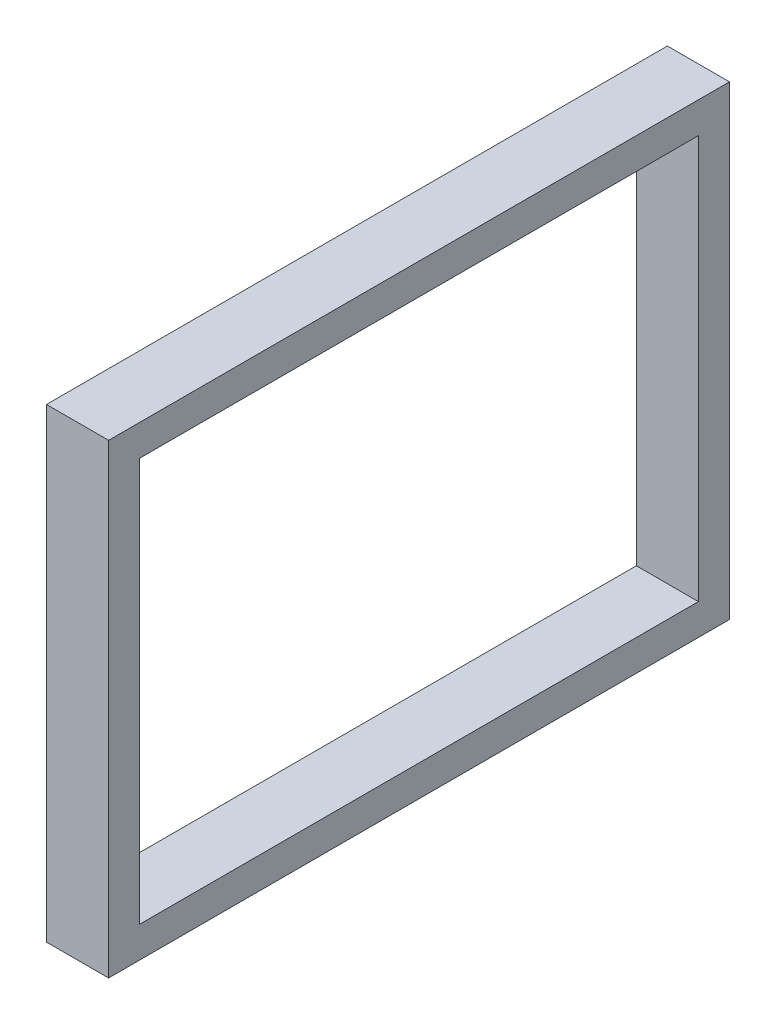
ISO-10303-21;
HEADER;
FILE_DESCRIPTION(('STEP AP214'),'2;1');
FILE_NAME('part.step','',(''),(''),'','','');
FILE_SCHEMA(('AUTOMOTIVE_DESIGN { 1 0 10303 214 1 1 1 1 }'));
ENDSEC;
DATA;
#1=APPLICATION_CONTEXT('core data for automotive mechanical design processes');
#2=APPLICATION_PROTOCOL_DEFINITION('international standard','automotive_design',2000,#1);
#3=PRODUCT_CONTEXT('',#1,'mechanical');
#4=PRODUCT('Part','Part','',(#3));
#5=PRODUCT_RELATED_PRODUCT_CATEGORY('part','',(#4));
#6=PRODUCT_DEFINITION_FORMATION('','',#4);
#7=PRODUCT_DEFINITION_CONTEXT('part definition',#1,'design');
#8=PRODUCT_DEFINITION('design','',#6,#7);
#9=PRODUCT_DEFINITION_SHAPE('','',#8);
#10=(LENGTH_UNIT() NAMED_UNIT(*) SI_UNIT(.MILLI.,.METRE.));
#11=(NAMED_UNIT(*) PLANE_ANGLE_UNIT() SI_UNIT($,.RADIAN.));
#12=(NAMED_UNIT(*) SI_UNIT($,.STERADIAN.) SOLID_ANGLE_UNIT());
#13=UNCERTAINTY_MEASURE_WITH_UNIT(LENGTH_MEASURE(1.E-05),#10,'distance_accuracy_value','');
#14=(GEOMETRIC_REPRESENTATION_CONTEXT(3) GLOBAL_UNCERTAINTY_ASSIGNED_CONTEXT((#13)) GLOBAL_UNIT_ASSIGNED_CONTEXT((#10,
#11,#12)) REPRESENTATION_CONTEXT('',''));
#15=CARTESIAN_POINT('',(0.,0.,0.));
#16=DIRECTION('',(0.,0.,1.));
#17=DIRECTION('',(1.,0.,0.));
#18=AXIS2_PLACEMENT_3D('',#15,#16,#17);
#19=CARTESIAN_POINT('',(60.,0.,0.));
#20=DIRECTION('',(-1.,0.,0.));
#21=DIRECTION('',(0.,0.,1.));
#22=AXIS2_PLACEMENT_3D('',#19,#20,#21);
#23=PLANE('',#22);
#24=DIRECTION('',(0.,1.,0.));
#25=VECTOR('',#24,1.);
#26=CARTESIAN_POINT('',(60.,-225.,-300.));
#27=LINE('',#26,#25);
#28=CARTESIAN_POINT('',(60.,-225.,-300.));
#29=VERTEX_POINT('',#28);
#30=CARTESIAN_POINT('',(60.,225.,-300.));
#31=VERTEX_POINT('',#30);
#32=EDGE_CURVE('E153',#29,#31,#27,.T.);
#33=ORIENTED_EDGE('',*,*,#32,.T.);
#34=DIRECTION('',(0.,0.,1.));
#35=VECTOR('',#34,1.);
#36=CARTESIAN_POINT('',(60.,225.,300.));
#37=LINE('',#36,#35);
#38=CARTESIAN_POINT('',(60.,225.,300.));
#39=VERTEX_POINT('',#38);
#40=EDGE_CURVE('E157',#31,#39,#37,.T.);
#41=ORIENTED_EDGE('',*,*,#40,.T.);
#42=DIRECTION('',(0.,-1.,0.));
#43=VECTOR('',#42,1.);
#44=CARTESIAN_POINT('',(60.,-225.,300.));
#45=LINE('',#44,#43);
#46=CARTESIAN_POINT('',(60.,-225.,300.));
#47=VERTEX_POINT('',#46);
#48=EDGE_CURVE('E161',#39,#47,#45,.T.);
#49=ORIENTED_EDGE('',*,*,#48,.T.);
#50=DIRECTION('',(0.,0.,-1.));
#51=VECTOR('',#50,1.);
#52=CARTESIAN_POINT('',(60.,-225.,300.));
#53=LINE('',#52,#51);
#54=EDGE_CURVE('E164',#47,#29,#53,.T.);
#55=ORIENTED_EDGE('',*,*,#54,.T.);
#56=EDGE_LOOP('',(#33,#41,#49,#55));
#57=FACE_BOUND('',#56,.T.);
#58=DIRECTION('',(0.,-1.,0.));
#59=VECTOR('',#58,1.);
#60=CARTESIAN_POINT('',(60.,-195.,270.));
#61=LINE('',#60,#59);
#62=CARTESIAN_POINT('',(60.,195.,270.));
#63=VERTEX_POINT('',#62);
#64=CARTESIAN_POINT('',(60.,-195.,270.));
#65=VERTEX_POINT('',#64);
#66=EDGE_CURVE('E105',#63,#65,#61,.T.);
#67=ORIENTED_EDGE('',*,*,#66,.F.);
#68=DIRECTION('',(0.,0.,1.));
#69=VECTOR('',#68,1.);
#70=CARTESIAN_POINT('',(60.,195.,270.));
#71=LINE('',#70,#69);
#72=CARTESIAN_POINT('',(60.,195.,-270.));
#73=VERTEX_POINT('',#72);
#74=EDGE_CURVE('E131',#73,#63,#71,.T.);
#75=ORIENTED_EDGE('',*,*,#74,.F.);
#76=DIRECTION('',(0.,1.,0.));
#77=VECTOR('',#76,1.);
#78=CARTESIAN_POINT('',(60.,-195.,-270.));
#79=LINE('',#78,#77);
#80=CARTESIAN_POINT('',(60.,-195.,-270.));
#81=VERTEX_POINT('',#80);
#82=EDGE_CURVE('E127',#81,#73,#79,.T.);
#83=ORIENTED_EDGE('',*,*,#82,.F.);
#84=DIRECTION('',(0.,0.,-1.));
#85=VECTOR('',#84,1.);
#86=CARTESIAN_POINT('',(60.,-195.,270.));
#87=LINE('',#86,#85);
#88=EDGE_CURVE('E114',#65,#81,#87,.T.);
#89=ORIENTED_EDGE('',*,*,#88,.F.);
#90=EDGE_LOOP('',(#67,#75,#83,#89));
#91=FACE_BOUND('',#90,.T.);
#92=ADVANCED_FACE('F39',(#57,#91),#23,.F.);
#93=CARTESIAN_POINT('',(0.,0.,0.));
#94=DIRECTION('',(-1.,0.,0.));
#95=DIRECTION('',(0.,0.,1.));
#96=AXIS2_PLACEMENT_3D('',#93,#94,#95);
#97=PLANE('',#96);
#98=DIRECTION('',(0.,1.,0.));
#99=VECTOR('',#98,1.);
#100=CARTESIAN_POINT('',(0.,-225.,-300.));
#101=LINE('',#100,#99);
#102=CARTESIAN_POINT('',(0.,-225.,-300.));
#103=VERTEX_POINT('',#102);
#104=CARTESIAN_POINT('',(0.,225.,-300.));
#105=VERTEX_POINT('',#104);
#106=EDGE_CURVE('E123',#103,#105,#101,.T.);
#107=ORIENTED_EDGE('',*,*,#106,.F.);
#108=DIRECTION('',(0.,0.,-1.));
#109=VECTOR('',#108,1.);
#110=CARTESIAN_POINT('',(0.,-225.,300.));
#111=LINE('',#110,#109);
#112=CARTESIAN_POINT('',(0.,-225.,300.));
#113=VERTEX_POINT('',#112);
#114=EDGE_CURVE('E158',#113,#103,#111,.T.);
#115=ORIENTED_EDGE('',*,*,#114,.F.);
#116=DIRECTION('',(0.,-1.,0.));
#117=VECTOR('',#116,1.);
#118=CARTESIAN_POINT('',(0.,-225.,300.));
#119=LINE('',#118,#117);
#120=CARTESIAN_POINT('',(0.,225.,300.));
#121=VERTEX_POINT('',#120);
#122=EDGE_CURVE('E174',#121,#113,#119,.T.);
#123=ORIENTED_EDGE('',*,*,#122,.F.);
#124=DIRECTION('',(0.,0.,1.));
#125=VECTOR('',#124,1.);
#126=CARTESIAN_POINT('',(0.,225.,300.));
#127=LINE('',#126,#125);
#128=EDGE_CURVE('E171',#105,#121,#127,.T.);
#129=ORIENTED_EDGE('',*,*,#128,.F.);
#130=EDGE_LOOP('',(#107,#115,#123,#129));
#131=FACE_BOUND('',#130,.T.);
#132=DIRECTION('',(0.,0.,1.));
#133=VECTOR('',#132,1.);
#134=CARTESIAN_POINT('',(0.,195.,270.));
#135=LINE('',#134,#133);
#136=CARTESIAN_POINT('',(0.,195.,-270.));
#137=VERTEX_POINT('',#136);
#138=CARTESIAN_POINT('',(0.,195.,270.));
#139=VERTEX_POINT('',#138);
#140=EDGE_CURVE('E115',#137,#139,#135,.T.);
#141=ORIENTED_EDGE('',*,*,#140,.T.);
#142=DIRECTION('',(0.,-1.,0.));
#143=VECTOR('',#142,1.);
#144=CARTESIAN_POINT('',(0.,-195.,270.));
#145=LINE('',#144,#143);
#146=CARTESIAN_POINT('',(0.,-195.,270.));
#147=VERTEX_POINT('',#146);
#148=EDGE_CURVE('E63',#139,#147,#145,.T.);
#149=ORIENTED_EDGE('',*,*,#148,.T.);
#150=DIRECTION('',(0.,0.,-1.));
#151=VECTOR('',#150,1.);
#152=CARTESIAN_POINT('',(0.,-195.,270.));
#153=LINE('',#152,#151);
#154=CARTESIAN_POINT('',(0.,-195.,-270.));
#155=VERTEX_POINT('',#154);
#156=EDGE_CURVE('E121',#147,#155,#153,.T.);
#157=ORIENTED_EDGE('',*,*,#156,.T.);
#158=DIRECTION('',(0.,1.,0.));
#159=VECTOR('',#158,1.);
#160=CARTESIAN_POINT('',(0.,-195.,-270.));
#161=LINE('',#160,#159);
#162=EDGE_CURVE('E140',#155,#137,#161,.T.);
#163=ORIENTED_EDGE('',*,*,#162,.T.);
#164=EDGE_LOOP('',(#141,#149,#157,#163));
#165=FACE_BOUND('',#164,.T.);
#166=ADVANCED_FACE('F197',(#131,#165),#97,.T.);
#167=CARTESIAN_POINT('',(60.,-225.,-300.));
#168=DIRECTION('',(0.,0.,1.));
#169=DIRECTION('',(1.,0.,0.));
#170=AXIS2_PLACEMENT_3D('',#167,#168,#169);
#171=PLANE('',#170);
#172=ORIENTED_EDGE('',*,*,#106,.T.);
#173=DIRECTION('',(-1.,0.,0.));
#174=VECTOR('',#173,1.);
#175=CARTESIAN_POINT('',(60.,225.,-300.));
#176=LINE('',#175,#174);
#177=EDGE_CURVE('E11',#31,#105,#176,.T.);
#178=ORIENTED_EDGE('',*,*,#177,.F.);
#179=ORIENTED_EDGE('',*,*,#32,.F.);
#180=DIRECTION('',(-1.,0.,0.));
#181=VECTOR('',#180,1.);
#182=CARTESIAN_POINT('',(60.,-225.,-300.));
#183=LINE('',#182,#181);
#184=EDGE_CURVE('E167',#29,#103,#183,.T.);
#185=ORIENTED_EDGE('',*,*,#184,.T.);
#186=EDGE_LOOP('',(#172,#178,#179,#185));
#187=FACE_BOUND('',#186,.T.);
#188=ADVANCED_FACE('F41',(#187),#171,.F.);
#189=CARTESIAN_POINT('',(60.,225.,300.));
#190=DIRECTION('',(0.,-1.,0.));
#191=DIRECTION('',(0.,0.,-1.));
#192=AXIS2_PLACEMENT_3D('',#189,#190,#191);
#193=PLANE('',#192);
#194=ORIENTED_EDGE('',*,*,#128,.T.);
#195=DIRECTION('',(-1.,0.,0.));
#196=VECTOR('',#195,1.);
#197=CARTESIAN_POINT('',(60.,225.,300.));
#198=LINE('',#197,#196);
#199=EDGE_CURVE('E48',#39,#121,#198,.T.);
#200=ORIENTED_EDGE('',*,*,#199,.F.);
#201=ORIENTED_EDGE('',*,*,#40,.F.);
#202=ORIENTED_EDGE('',*,*,#177,.T.);
#203=EDGE_LOOP('',(#194,#200,#201,#202));
#204=FACE_BOUND('',#203,.T.);
#205=ADVANCED_FACE('F207',(#204),#193,.F.);
#206=CARTESIAN_POINT('',(60.,-225.,300.));
#207=DIRECTION('',(0.,0.,-1.));
#208=DIRECTION('',(-1.,0.,0.));
#209=AXIS2_PLACEMENT_3D('',#206,#207,#208);
#210=PLANE('',#209);
#211=ORIENTED_EDGE('',*,*,#122,.T.);
#212=DIRECTION('',(-1.,0.,0.));
#213=VECTOR('',#212,1.);
#214=CARTESIAN_POINT('',(60.,-225.,300.));
#215=LINE('',#214,#213);
#216=EDGE_CURVE('E182',#47,#113,#215,.T.);
#217=ORIENTED_EDGE('',*,*,#216,.F.);
#218=ORIENTED_EDGE('',*,*,#48,.F.);
#219=ORIENTED_EDGE('',*,*,#199,.T.);
#220=EDGE_LOOP('',(#211,#217,#218,#219));
#221=FACE_BOUND('',#220,.T.);
#222=ADVANCED_FACE('F191',(#221),#210,.F.);
#223=CARTESIAN_POINT('',(60.,-225.,300.));
#224=DIRECTION('',(0.,1.,0.));
#225=DIRECTION('',(0.,0.,1.));
#226=AXIS2_PLACEMENT_3D('',#223,#224,#225);
#227=PLANE('',#226);
#228=ORIENTED_EDGE('',*,*,#114,.T.);
#229=ORIENTED_EDGE('',*,*,#184,.F.);
#230=ORIENTED_EDGE('',*,*,#54,.F.);
#231=ORIENTED_EDGE('',*,*,#216,.T.);
#232=EDGE_LOOP('',(#228,#229,#230,#231));
#233=FACE_BOUND('',#232,.T.);
#234=ADVANCED_FACE('F201',(#233),#227,.F.);
#235=CARTESIAN_POINT('',(60.,-195.,270.));
#236=DIRECTION('',(0.,0.,-1.));
#237=DIRECTION('',(-1.,0.,0.));
#238=AXIS2_PLACEMENT_3D('',#235,#236,#237);
#239=PLANE('',#238);
#240=ORIENTED_EDGE('',*,*,#148,.F.);
#241=DIRECTION('',(-1.,0.,0.));
#242=VECTOR('',#241,1.);
#243=CARTESIAN_POINT('',(60.,195.,270.));
#244=LINE('',#243,#242);
#245=EDGE_CURVE('E109',#63,#139,#244,.T.);
#246=ORIENTED_EDGE('',*,*,#245,.F.);
#247=ORIENTED_EDGE('',*,*,#66,.T.);
#248=DIRECTION('',(-1.,0.,0.));
#249=VECTOR('',#248,1.);
#250=CARTESIAN_POINT('',(60.,-195.,270.));
#251=LINE('',#250,#249);
#252=EDGE_CURVE('E108',#65,#147,#251,.T.);
#253=ORIENTED_EDGE('',*,*,#252,.T.);
#254=EDGE_LOOP('',(#240,#246,#247,#253));
#255=FACE_BOUND('',#254,.T.);
#256=ADVANCED_FACE('F107',(#255),#239,.T.);
#257=CARTESIAN_POINT('',(60.,-195.,270.));
#258=DIRECTION('',(0.,1.,0.));
#259=DIRECTION('',(0.,0.,1.));
#260=AXIS2_PLACEMENT_3D('',#257,#258,#259);
#261=PLANE('',#260);
#262=ORIENTED_EDGE('',*,*,#156,.F.);
#263=ORIENTED_EDGE('',*,*,#252,.F.);
#264=ORIENTED_EDGE('',*,*,#88,.T.);
#265=DIRECTION('',(-1.,0.,0.));
#266=VECTOR('',#265,1.);
#267=CARTESIAN_POINT('',(60.,-195.,-270.));
#268=LINE('',#267,#266);
#269=EDGE_CURVE('E124',#81,#155,#268,.T.);
#270=ORIENTED_EDGE('',*,*,#269,.T.);
#271=EDGE_LOOP('',(#262,#263,#264,#270));
#272=FACE_BOUND('',#271,.T.);
#273=ADVANCED_FACE('F118',(#272),#261,.T.);
#274=CARTESIAN_POINT('',(60.,-195.,-270.));
#275=DIRECTION('',(0.,0.,1.));
#276=DIRECTION('',(0.,-1.,0.));
#277=AXIS2_PLACEMENT_3D('',#274,#275,#276);
#278=PLANE('',#277);
#279=ORIENTED_EDGE('',*,*,#162,.F.);
#280=ORIENTED_EDGE('',*,*,#269,.F.);
#281=ORIENTED_EDGE('',*,*,#82,.T.);
#282=DIRECTION('',(-1.,0.,0.));
#283=VECTOR('',#282,1.);
#284=CARTESIAN_POINT('',(60.,195.,-270.));
#285=LINE('',#284,#283);
#286=EDGE_CURVE('E55',#73,#137,#285,.T.);
#287=ORIENTED_EDGE('',*,*,#286,.T.);
#288=EDGE_LOOP('',(#279,#280,#281,#287));
#289=FACE_BOUND('',#288,.T.);
#290=ADVANCED_FACE('F230',(#289),#278,.T.);
#291=CARTESIAN_POINT('',(60.,195.,270.));
#292=DIRECTION('',(0.,-1.,0.));
#293=DIRECTION('',(0.,0.,-1.));
#294=AXIS2_PLACEMENT_3D('',#291,#292,#293);
#295=PLANE('',#294);
#296=ORIENTED_EDGE('',*,*,#140,.F.);
#297=ORIENTED_EDGE('',*,*,#286,.F.);
#298=ORIENTED_EDGE('',*,*,#74,.T.);
#299=ORIENTED_EDGE('',*,*,#245,.T.);
#300=EDGE_LOOP('',(#296,#297,#298,#299));
#301=FACE_BOUND('',#300,.T.);
#302=ADVANCED_FACE('F234',(#301),#295,.T.);
#303=CLOSED_SHELL('',(#92,#166,#188,#205,#222,#234,#256,#273,#290,#302));
#304=MANIFOLD_SOLID_BREP('B2',#303);
#305=ADVANCED_BREP_SHAPE_REPRESENTATION('',(#18,#304),#14);
#306=SHAPE_DEFINITION_REPRESENTATION(#9,#305);
ENDSEC;
END-ISO-10303-21;
